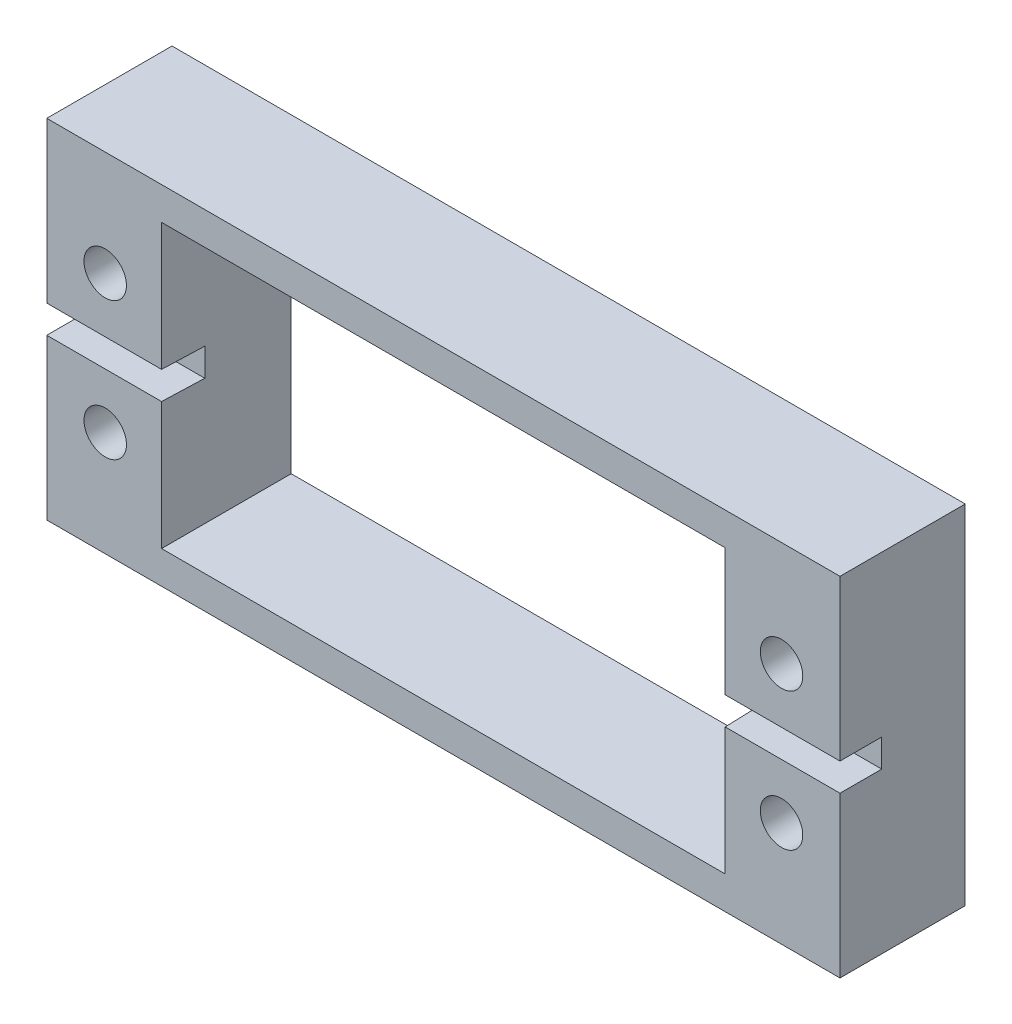
ISO-10303-21;
HEADER;
FILE_DESCRIPTION(('STEP AP214'),'2;1');
FILE_NAME('part.step','',(''),(''),'','','');
FILE_SCHEMA(('AUTOMOTIVE_DESIGN { 1 0 10303 214 1 1 1 1 }'));
ENDSEC;
DATA;
#1=APPLICATION_CONTEXT('core data for automotive mechanical design processes');
#2=APPLICATION_PROTOCOL_DEFINITION('international standard','automotive_design',2000,#1);
#3=PRODUCT_CONTEXT('',#1,'mechanical');
#4=PRODUCT('Part','Part','',(#3));
#5=PRODUCT_RELATED_PRODUCT_CATEGORY('part','',(#4));
#6=PRODUCT_DEFINITION_FORMATION('','',#4);
#7=PRODUCT_DEFINITION_CONTEXT('part definition',#1,'design');
#8=PRODUCT_DEFINITION('design','',#6,#7);
#9=PRODUCT_DEFINITION_SHAPE('','',#8);
#10=(LENGTH_UNIT() NAMED_UNIT(*) SI_UNIT(.MILLI.,.METRE.));
#11=(NAMED_UNIT(*) PLANE_ANGLE_UNIT() SI_UNIT($,.RADIAN.));
#12=(NAMED_UNIT(*) SI_UNIT($,.STERADIAN.) SOLID_ANGLE_UNIT());
#13=UNCERTAINTY_MEASURE_WITH_UNIT(LENGTH_MEASURE(1.E-05),#10,'distance_accuracy_value','');
#14=(GEOMETRIC_REPRESENTATION_CONTEXT(3) GLOBAL_UNCERTAINTY_ASSIGNED_CONTEXT((#13)) GLOBAL_UNIT_ASSIGNED_CONTEXT((#10,
#11,#12)) REPRESENTATION_CONTEXT('',''));
#15=CARTESIAN_POINT('',(0.,0.,0.));
#16=DIRECTION('',(0.,0.,1.));
#17=DIRECTION('',(1.,0.,0.));
#18=AXIS2_PLACEMENT_3D('',#15,#16,#17);
#19=CARTESIAN_POINT('',(-28.5,-1.,6.));
#20=DIRECTION('',(0.,-1.,0.));
#21=DIRECTION('',(0.,0.,-1.));
#22=AXIS2_PLACEMENT_3D('',#19,#20,#21);
#23=PLANE('',#22);
#24=DIRECTION('',(1.,0.,0.));
#25=VECTOR('',#24,1.);
#26=CARTESIAN_POINT('',(-28.5,-1.,6.));
#27=LINE('',#26,#25);
#28=CARTESIAN_POINT('',(20.1452376915248,-1.,6.));
#29=VERTEX_POINT('',#28);
#30=CARTESIAN_POINT('',(28.5,-1.,6.));
#31=VERTEX_POINT('',#30);
#32=EDGE_CURVE('E205',#29,#31,#27,.T.);
#33=ORIENTED_EDGE('',*,*,#32,.F.);
#34=DIRECTION('',(0.034899496702501,0.,0.999390827019096));
#35=VECTOR('',#34,1.);
#36=CARTESIAN_POINT('',(20.085989014467,-1.,4.30333987709721));
#37=LINE('',#36,#35);
#38=CARTESIAN_POINT('',(20.25,-0.999999999999999,9.));
#39=VERTEX_POINT('',#38);
#40=EDGE_CURVE('E189',#29,#39,#37,.T.);
#41=ORIENTED_EDGE('',*,*,#40,.T.);
#42=DIRECTION('',(1.,0.,0.));
#43=VECTOR('',#42,1.);
#44=CARTESIAN_POINT('',(-28.5,-1.,9.));
#45=LINE('',#44,#43);
#46=CARTESIAN_POINT('',(28.5,-1.,9.));
#47=VERTEX_POINT('',#46);
#48=EDGE_CURVE('E212',#39,#47,#45,.T.);
#49=ORIENTED_EDGE('',*,*,#48,.T.);
#50=DIRECTION('',(0.,0.,1.));
#51=VECTOR('',#50,1.);
#52=CARTESIAN_POINT('',(28.5,-1.,6.));
#53=LINE('',#52,#51);
#54=EDGE_CURVE('E215',#31,#47,#53,.T.);
#55=ORIENTED_EDGE('',*,*,#54,.F.);
#56=EDGE_LOOP('',(#33,#41,#49,#55));
#57=FACE_BOUND('',#56,.T.);
#58=ADVANCED_FACE('F35',(#57),#23,.F.);
#59=CARTESIAN_POINT('',(-28.5,1.,6.));
#60=DIRECTION('',(0.,1.,0.));
#61=DIRECTION('',(0.,0.,1.));
#62=AXIS2_PLACEMENT_3D('',#59,#60,#61);
#63=PLANE('',#62);
#64=DIRECTION('',(-1.,0.,0.));
#65=VECTOR('',#64,1.);
#66=CARTESIAN_POINT('',(-28.5,1.,9.));
#67=LINE('',#66,#65);
#68=CARTESIAN_POINT('',(28.5,1.,9.));
#69=VERTEX_POINT('',#68);
#70=CARTESIAN_POINT('',(20.25,0.999999999999999,9.));
#71=VERTEX_POINT('',#70);
#72=EDGE_CURVE('E210',#69,#71,#67,.T.);
#73=ORIENTED_EDGE('',*,*,#72,.T.);
#74=DIRECTION('',(-0.034899496702501,0.,-0.999390827019096));
#75=VECTOR('',#74,1.);
#76=CARTESIAN_POINT('',(20.085989014467,1.,4.30333987709721));
#77=LINE('',#76,#75);
#78=CARTESIAN_POINT('',(20.1452376915248,1.,6.));
#79=VERTEX_POINT('',#78);
#80=EDGE_CURVE('E160',#71,#79,#77,.T.);
#81=ORIENTED_EDGE('',*,*,#80,.T.);
#82=DIRECTION('',(-1.,0.,0.));
#83=VECTOR('',#82,1.);
#84=CARTESIAN_POINT('',(-28.5,1.,6.));
#85=LINE('',#84,#83);
#86=CARTESIAN_POINT('',(28.5,1.,6.));
#87=VERTEX_POINT('',#86);
#88=EDGE_CURVE('E200',#87,#79,#85,.T.);
#89=ORIENTED_EDGE('',*,*,#88,.F.);
#90=DIRECTION('',(0.,0.,1.));
#91=VECTOR('',#90,1.);
#92=CARTESIAN_POINT('',(28.5,1.,6.));
#93=LINE('',#92,#91);
#94=EDGE_CURVE('E209',#87,#69,#93,.T.);
#95=ORIENTED_EDGE('',*,*,#94,.T.);
#96=EDGE_LOOP('',(#73,#81,#89,#95));
#97=FACE_BOUND('',#96,.T.);
#98=ADVANCED_FACE('F298',(#97),#63,.F.);
#99=CARTESIAN_POINT('',(0.,0.,6.));
#100=DIRECTION('',(0.,0.,-1.));
#101=DIRECTION('',(-1.,0.,0.));
#102=AXIS2_PLACEMENT_3D('',#99,#100,#101);
#103=PLANE('',#102);
#104=ORIENTED_EDGE('',*,*,#88,.T.);
#105=DIRECTION('',(0.,-1.,0.));
#106=VECTOR('',#105,1.);
#107=CARTESIAN_POINT('',(20.1452376915248,0.,6.));
#108=LINE('',#107,#106);
#109=EDGE_CURVE('E283',#79,#29,#108,.T.);
#110=ORIENTED_EDGE('',*,*,#109,.T.);
#111=ORIENTED_EDGE('',*,*,#32,.T.);
#112=DIRECTION('',(0.,1.,0.));
#113=VECTOR('',#112,1.);
#114=CARTESIAN_POINT('',(28.5,-1.,6.));
#115=LINE('',#114,#113);
#116=EDGE_CURVE('E195',#31,#87,#115,.T.);
#117=ORIENTED_EDGE('',*,*,#116,.T.);
#118=EDGE_LOOP('',(#104,#110,#111,#117));
#119=FACE_BOUND('',#118,.T.);
#120=ADVANCED_FACE('F287',(#119),#103,.F.);
#121=CARTESIAN_POINT('',(0.,0.,9.));
#122=DIRECTION('',(0.,0.,-1.));
#123=DIRECTION('',(-1.,0.,0.));
#124=AXIS2_PLACEMENT_3D('',#121,#122,#123);
#125=PLANE('',#124);
#126=CARTESIAN_POINT('',(24.3,-4.95,9.));
#127=DIRECTION('',(0.,0.,1.));
#128=DIRECTION('',(-1.,0.,0.));
#129=AXIS2_PLACEMENT_3D('',#126,#127,#128);
#130=CIRCLE('',#129,1.525);
#131=CARTESIAN_POINT('',(22.775,-4.95,9.));
#132=VERTEX_POINT('',#131);
#133=EDGE_CURVE('E225',#132,#132,#130,.T.);
#134=ORIENTED_EDGE('',*,*,#133,.F.);
#135=EDGE_LOOP('',(#134));
#136=FACE_BOUND('',#135,.T.);
#137=CARTESIAN_POINT('',(-24.3,-4.95,9.));
#138=DIRECTION('',(0.,0.,1.));
#139=DIRECTION('',(1.,0.,0.));
#140=AXIS2_PLACEMENT_3D('',#137,#138,#139);
#141=CIRCLE('',#140,1.525);
#142=CARTESIAN_POINT('',(-22.775,-4.95,9.));
#143=VERTEX_POINT('',#142);
#144=EDGE_CURVE('E231',#143,#143,#141,.T.);
#145=ORIENTED_EDGE('',*,*,#144,.F.);
#146=EDGE_LOOP('',(#145));
#147=FACE_BOUND('',#146,.T.);
#148=ORIENTED_EDGE('',*,*,#48,.F.);
#149=DIRECTION('',(0.,1.,0.));
#150=VECTOR('',#149,1.);
#151=CARTESIAN_POINT('',(20.25,-10.15,9.));
#152=LINE('',#151,#150);
#153=CARTESIAN_POINT('',(20.25,-10.15,9.));
#154=VERTEX_POINT('',#153);
#155=EDGE_CURVE('E164',#154,#39,#152,.T.);
#156=ORIENTED_EDGE('',*,*,#155,.F.);
#157=DIRECTION('',(1.,0.,0.));
#158=VECTOR('',#157,1.);
#159=CARTESIAN_POINT('',(-20.25,-10.15,9.));
#160=LINE('',#159,#158);
#161=CARTESIAN_POINT('',(-20.25,-10.15,9.));
#162=VERTEX_POINT('',#161);
#163=EDGE_CURVE('E154',#162,#154,#160,.T.);
#164=ORIENTED_EDGE('',*,*,#163,.F.);
#165=DIRECTION('',(0.,-1.,0.));
#166=VECTOR('',#165,1.);
#167=CARTESIAN_POINT('',(-20.25,-10.15,9.));
#168=LINE('',#167,#166);
#169=CARTESIAN_POINT('',(-20.25,-0.999999999999999,9.));
#170=VERTEX_POINT('',#169);
#171=EDGE_CURVE('E170',#170,#162,#168,.T.);
#172=ORIENTED_EDGE('',*,*,#171,.F.);
#173=CARTESIAN_POINT('',(-28.5,-1.,9.));
#174=VERTEX_POINT('',#173);
#175=EDGE_CURVE('E199',#174,#170,#45,.T.);
#176=ORIENTED_EDGE('',*,*,#175,.F.);
#177=DIRECTION('',(0.,-1.,0.));
#178=VECTOR('',#177,1.);
#179=CARTESIAN_POINT('',(-28.5,-12.5,9.));
#180=LINE('',#179,#178);
#181=CARTESIAN_POINT('',(-28.5,-12.5,9.));
#182=VERTEX_POINT('',#181);
#183=EDGE_CURVE('E255',#174,#182,#180,.T.);
#184=ORIENTED_EDGE('',*,*,#183,.T.);
#185=DIRECTION('',(1.,0.,0.));
#186=VECTOR('',#185,1.);
#187=CARTESIAN_POINT('',(-28.5,-12.5,9.));
#188=LINE('',#187,#186);
#189=CARTESIAN_POINT('',(28.5,-12.5,9.));
#190=VERTEX_POINT('',#189);
#191=EDGE_CURVE('E259',#182,#190,#188,.T.);
#192=ORIENTED_EDGE('',*,*,#191,.T.);
#193=DIRECTION('',(0.,1.,0.));
#194=VECTOR('',#193,1.);
#195=CARTESIAN_POINT('',(28.5,-12.5,9.));
#196=LINE('',#195,#194);
#197=EDGE_CURVE('E249',#190,#47,#196,.T.);
#198=ORIENTED_EDGE('',*,*,#197,.T.);
#199=EDGE_LOOP('',(#148,#156,#164,#172,#176,#184,#192,#198));
#200=FACE_BOUND('',#199,.T.);
#201=ADVANCED_FACE('F330',(#136,#147,#200),#125,.F.);
#202=DIRECTION('',(-1.,0.,0.));
#203=VECTOR('',#202,1.);
#204=CARTESIAN_POINT('',(-20.25,10.15,9.));
#205=LINE('',#204,#203);
#206=CARTESIAN_POINT('',(20.25,10.15,9.));
#207=VERTEX_POINT('',#206);
#208=CARTESIAN_POINT('',(-20.25,10.15,9.));
#209=VERTEX_POINT('',#208);
#210=EDGE_CURVE('E149',#207,#209,#205,.T.);
#211=ORIENTED_EDGE('',*,*,#210,.F.);
#212=EDGE_CURVE('E157',#71,#207,#152,.T.);
#213=ORIENTED_EDGE('',*,*,#212,.F.);
#214=ORIENTED_EDGE('',*,*,#72,.F.);
#215=CARTESIAN_POINT('',(28.5,12.5,9.));
#216=VERTEX_POINT('',#215);
#217=EDGE_CURVE('E253',#69,#216,#196,.T.);
#218=ORIENTED_EDGE('',*,*,#217,.T.);
#219=DIRECTION('',(-1.,0.,0.));
#220=VECTOR('',#219,1.);
#221=CARTESIAN_POINT('',(-28.5,12.5,9.));
#222=LINE('',#221,#220);
#223=CARTESIAN_POINT('',(-28.5,12.5,9.));
#224=VERTEX_POINT('',#223);
#225=EDGE_CURVE('E252',#216,#224,#222,.T.);
#226=ORIENTED_EDGE('',*,*,#225,.T.);
#227=CARTESIAN_POINT('',(-28.5,1.,9.));
#228=VERTEX_POINT('',#227);
#229=EDGE_CURVE('E256',#224,#228,#180,.T.);
#230=ORIENTED_EDGE('',*,*,#229,.T.);
#231=CARTESIAN_POINT('',(-20.25,0.999999999999999,9.));
#232=VERTEX_POINT('',#231);
#233=EDGE_CURVE('E194',#232,#228,#67,.T.);
#234=ORIENTED_EDGE('',*,*,#233,.F.);
#235=EDGE_CURVE('E169',#209,#232,#168,.T.);
#236=ORIENTED_EDGE('',*,*,#235,.F.);
#237=EDGE_LOOP('',(#211,#213,#214,#218,#226,#230,#234,#236));
#238=FACE_BOUND('',#237,.T.);
#239=CARTESIAN_POINT('',(24.3,4.95,9.));
#240=DIRECTION('',(0.,0.,1.));
#241=DIRECTION('',(1.,0.,0.));
#242=AXIS2_PLACEMENT_3D('',#239,#240,#241);
#243=CIRCLE('',#242,1.525);
#244=CARTESIAN_POINT('',(25.825,4.95,9.));
#245=VERTEX_POINT('',#244);
#246=EDGE_CURVE('E243',#245,#245,#243,.T.);
#247=ORIENTED_EDGE('',*,*,#246,.F.);
#248=EDGE_LOOP('',(#247));
#249=FACE_BOUND('',#248,.T.);
#250=CARTESIAN_POINT('',(-24.3,4.95,9.));
#251=DIRECTION('',(0.,0.,1.));
#252=DIRECTION('',(-1.,0.,0.));
#253=AXIS2_PLACEMENT_3D('',#250,#251,#252);
#254=CIRCLE('',#253,1.525);
#255=CARTESIAN_POINT('',(-25.825,4.95,9.));
#256=VERTEX_POINT('',#255);
#257=EDGE_CURVE('E237',#256,#256,#254,.T.);
#258=ORIENTED_EDGE('',*,*,#257,.F.);
#259=EDGE_LOOP('',(#258));
#260=FACE_BOUND('',#259,.T.);
#261=ADVANCED_FACE('F166',(#238,#249,#260),#125,.F.);
#262=CARTESIAN_POINT('',(0.,0.,0.));
#263=DIRECTION('',(0.,0.,-1.));
#264=DIRECTION('',(-1.,0.,0.));
#265=AXIS2_PLACEMENT_3D('',#262,#263,#264);
#266=PLANE('',#265);
#267=DIRECTION('',(0.,-1.,0.));
#268=VECTOR('',#267,1.);
#269=CARTESIAN_POINT('',(19.9357130745743,0.,0.));
#270=LINE('',#269,#268);
#271=CARTESIAN_POINT('',(19.9357130745743,9.83571307457427,0.));
#272=VERTEX_POINT('',#271);
#273=CARTESIAN_POINT('',(19.9357130745743,-9.83571307457427,0.));
#274=VERTEX_POINT('',#273);
#275=EDGE_CURVE('E192',#272,#274,#270,.T.);
#276=ORIENTED_EDGE('',*,*,#275,.F.);
#277=DIRECTION('',(1.,0.,0.));
#278=VECTOR('',#277,1.);
#279=CARTESIAN_POINT('',(0.,9.83571307457427,0.));
#280=LINE('',#279,#278);
#281=CARTESIAN_POINT('',(-19.9357130745743,9.83571307457427,0.));
#282=VERTEX_POINT('',#281);
#283=EDGE_CURVE('E43',#282,#272,#280,.T.);
#284=ORIENTED_EDGE('',*,*,#283,.F.);
#285=DIRECTION('',(0.,1.,0.));
#286=VECTOR('',#285,1.);
#287=CARTESIAN_POINT('',(-19.9357130745743,0.,0.));
#288=LINE('',#287,#286);
#289=CARTESIAN_POINT('',(-19.9357130745743,-9.83571307457427,0.));
#290=VERTEX_POINT('',#289);
#291=EDGE_CURVE('E186',#290,#282,#288,.T.);
#292=ORIENTED_EDGE('',*,*,#291,.F.);
#293=DIRECTION('',(-1.,0.,0.));
#294=VECTOR('',#293,1.);
#295=CARTESIAN_POINT('',(0.,-9.83571307457427,0.));
#296=LINE('',#295,#294);
#297=EDGE_CURVE('E11',#274,#290,#296,.T.);
#298=ORIENTED_EDGE('',*,*,#297,.F.);
#299=EDGE_LOOP('',(#276,#284,#292,#298));
#300=FACE_BOUND('',#299,.T.);
#301=CARTESIAN_POINT('',(-24.3,-4.95,0.));
#302=DIRECTION('',(0.,0.,1.));
#303=DIRECTION('',(1.,0.,0.));
#304=AXIS2_PLACEMENT_3D('',#301,#302,#303);
#305=CIRCLE('',#304,1.525);
#306=CARTESIAN_POINT('',(-22.775,-4.95,0.));
#307=VERTEX_POINT('',#306);
#308=EDGE_CURVE('E228',#307,#307,#305,.T.);
#309=ORIENTED_EDGE('',*,*,#308,.T.);
#310=EDGE_LOOP('',(#309));
#311=FACE_BOUND('',#310,.T.);
#312=CARTESIAN_POINT('',(24.3,4.95,0.));
#313=DIRECTION('',(0.,0.,1.));
#314=DIRECTION('',(1.,0.,0.));
#315=AXIS2_PLACEMENT_3D('',#312,#313,#314);
#316=CIRCLE('',#315,1.525);
#317=CARTESIAN_POINT('',(25.825,4.95,0.));
#318=VERTEX_POINT('',#317);
#319=EDGE_CURVE('E240',#318,#318,#316,.T.);
#320=ORIENTED_EDGE('',*,*,#319,.T.);
#321=EDGE_LOOP('',(#320));
#322=FACE_BOUND('',#321,.T.);
#323=DIRECTION('',(0.,1.,0.));
#324=VECTOR('',#323,1.);
#325=CARTESIAN_POINT('',(28.5,-12.5,0.));
#326=LINE('',#325,#324);
#327=CARTESIAN_POINT('',(28.5,-12.5,0.));
#328=VERTEX_POINT('',#327);
#329=CARTESIAN_POINT('',(28.5,12.5,0.));
#330=VERTEX_POINT('',#329);
#331=EDGE_CURVE('E246',#328,#330,#326,.T.);
#332=ORIENTED_EDGE('',*,*,#331,.F.);
#333=DIRECTION('',(1.,0.,0.));
#334=VECTOR('',#333,1.);
#335=CARTESIAN_POINT('',(-28.5,-12.5,0.));
#336=LINE('',#335,#334);
#337=CARTESIAN_POINT('',(-28.5,-12.5,0.));
#338=VERTEX_POINT('',#337);
#339=EDGE_CURVE('E268',#338,#328,#336,.T.);
#340=ORIENTED_EDGE('',*,*,#339,.F.);
#341=DIRECTION('',(0.,-1.,0.));
#342=VECTOR('',#341,1.);
#343=CARTESIAN_POINT('',(-28.5,-12.5,0.));
#344=LINE('',#343,#342);
#345=CARTESIAN_POINT('',(-28.5,12.5,0.));
#346=VERTEX_POINT('',#345);
#347=EDGE_CURVE('E266',#346,#338,#344,.T.);
#348=ORIENTED_EDGE('',*,*,#347,.F.);
#349=DIRECTION('',(-1.,0.,0.));
#350=VECTOR('',#349,1.);
#351=CARTESIAN_POINT('',(-28.5,12.5,0.));
#352=LINE('',#351,#350);
#353=EDGE_CURVE('E264',#330,#346,#352,.T.);
#354=ORIENTED_EDGE('',*,*,#353,.F.);
#355=EDGE_LOOP('',(#332,#340,#348,#354));
#356=FACE_BOUND('',#355,.T.);
#357=CARTESIAN_POINT('',(-24.3,4.95,0.));
#358=DIRECTION('',(0.,0.,1.));
#359=DIRECTION('',(-1.,0.,0.));
#360=AXIS2_PLACEMENT_3D('',#357,#358,#359);
#361=CIRCLE('',#360,1.525);
#362=CARTESIAN_POINT('',(-25.825,4.95,0.));
#363=VERTEX_POINT('',#362);
#364=EDGE_CURVE('E234',#363,#363,#361,.T.);
#365=ORIENTED_EDGE('',*,*,#364,.T.);
#366=EDGE_LOOP('',(#365));
#367=FACE_BOUND('',#366,.T.);
#368=CARTESIAN_POINT('',(24.3,-4.95,0.));
#369=DIRECTION('',(0.,0.,1.));
#370=DIRECTION('',(-1.,0.,0.));
#371=AXIS2_PLACEMENT_3D('',#368,#369,#370);
#372=CIRCLE('',#371,1.525);
#373=CARTESIAN_POINT('',(22.775,-4.95,0.));
#374=VERTEX_POINT('',#373);
#375=EDGE_CURVE('E218',#374,#374,#372,.T.);
#376=ORIENTED_EDGE('',*,*,#375,.T.);
#377=EDGE_LOOP('',(#376));
#378=FACE_BOUND('',#377,.T.);
#379=ADVANCED_FACE('F308',(#300,#311,#322,#356,#367,#378),#266,.T.);
#380=CARTESIAN_POINT('',(28.5,-12.5,9.));
#381=DIRECTION('',(-1.,0.,0.));
#382=DIRECTION('',(0.,0.,1.));
#383=AXIS2_PLACEMENT_3D('',#380,#381,#382);
#384=PLANE('',#383);
#385=ORIENTED_EDGE('',*,*,#116,.F.);
#386=ORIENTED_EDGE('',*,*,#54,.T.);
#387=ORIENTED_EDGE('',*,*,#197,.F.);
#388=DIRECTION('',(0.,0.,-1.));
#389=VECTOR('',#388,1.);
#390=CARTESIAN_POINT('',(28.5,-12.5,9.));
#391=LINE('',#390,#389);
#392=EDGE_CURVE('E261',#190,#328,#391,.T.);
#393=ORIENTED_EDGE('',*,*,#392,.T.);
#394=ORIENTED_EDGE('',*,*,#331,.T.);
#395=DIRECTION('',(0.,0.,-1.));
#396=VECTOR('',#395,1.);
#397=CARTESIAN_POINT('',(28.5,12.5,9.));
#398=LINE('',#397,#396);
#399=EDGE_CURVE('E278',#216,#330,#398,.T.);
#400=ORIENTED_EDGE('',*,*,#399,.F.);
#401=ORIENTED_EDGE('',*,*,#217,.F.);
#402=ORIENTED_EDGE('',*,*,#94,.F.);
#403=EDGE_LOOP('',(#385,#386,#387,#393,#394,#400,#401,#402));
#404=FACE_BOUND('',#403,.T.);
#405=ADVANCED_FACE('F37',(#404),#384,.F.);
#406=CARTESIAN_POINT('',(-28.5,12.5,9.));
#407=DIRECTION('',(0.,-1.,0.));
#408=DIRECTION('',(0.,0.,-1.));
#409=AXIS2_PLACEMENT_3D('',#406,#407,#408);
#410=PLANE('',#409);
#411=ORIENTED_EDGE('',*,*,#353,.T.);
#412=DIRECTION('',(0.,0.,-1.));
#413=VECTOR('',#412,1.);
#414=CARTESIAN_POINT('',(-28.5,12.5,9.));
#415=LINE('',#414,#413);
#416=EDGE_CURVE('E275',#224,#346,#415,.T.);
#417=ORIENTED_EDGE('',*,*,#416,.F.);
#418=ORIENTED_EDGE('',*,*,#225,.F.);
#419=ORIENTED_EDGE('',*,*,#399,.T.);
#420=EDGE_LOOP('',(#411,#417,#418,#419));
#421=FACE_BOUND('',#420,.T.);
#422=ADVANCED_FACE('F302',(#421),#410,.F.);
#423=CARTESIAN_POINT('',(-28.5,-12.5,9.));
#424=DIRECTION('',(1.,0.,0.));
#425=DIRECTION('',(0.,0.,-1.));
#426=AXIS2_PLACEMENT_3D('',#423,#424,#425);
#427=PLANE('',#426);
#428=ORIENTED_EDGE('',*,*,#183,.F.);
#429=DIRECTION('',(0.,0.,1.));
#430=VECTOR('',#429,1.);
#431=CARTESIAN_POINT('',(-28.5,-1.,6.));
#432=LINE('',#431,#430);
#433=CARTESIAN_POINT('',(-28.5,-1.,6.));
#434=VERTEX_POINT('',#433);
#435=EDGE_CURVE('E219',#434,#174,#432,.T.);
#436=ORIENTED_EDGE('',*,*,#435,.F.);
#437=DIRECTION('',(0.,-1.,0.));
#438=VECTOR('',#437,1.);
#439=CARTESIAN_POINT('',(-28.5,-1.,6.));
#440=LINE('',#439,#438);
#441=CARTESIAN_POINT('',(-28.5,1.,6.));
#442=VERTEX_POINT('',#441);
#443=EDGE_CURVE('E203',#442,#434,#440,.T.);
#444=ORIENTED_EDGE('',*,*,#443,.F.);
#445=DIRECTION('',(0.,0.,1.));
#446=VECTOR('',#445,1.);
#447=CARTESIAN_POINT('',(-28.5,1.,6.));
#448=LINE('',#447,#446);
#449=EDGE_CURVE('E221',#442,#228,#448,.T.);
#450=ORIENTED_EDGE('',*,*,#449,.T.);
#451=ORIENTED_EDGE('',*,*,#229,.F.);
#452=ORIENTED_EDGE('',*,*,#416,.T.);
#453=ORIENTED_EDGE('',*,*,#347,.T.);
#454=DIRECTION('',(0.,0.,-1.));
#455=VECTOR('',#454,1.);
#456=CARTESIAN_POINT('',(-28.5,-12.5,9.));
#457=LINE('',#456,#455);
#458=EDGE_CURVE('E272',#182,#338,#457,.T.);
#459=ORIENTED_EDGE('',*,*,#458,.F.);
#460=EDGE_LOOP('',(#428,#436,#444,#450,#451,#452,#453,#459));
#461=FACE_BOUND('',#460,.T.);
#462=ADVANCED_FACE('F313',(#461),#427,.F.);
#463=CARTESIAN_POINT('',(-28.5,-12.5,9.));
#464=DIRECTION('',(0.,1.,0.));
#465=DIRECTION('',(0.,0.,1.));
#466=AXIS2_PLACEMENT_3D('',#463,#464,#465);
#467=PLANE('',#466);
#468=ORIENTED_EDGE('',*,*,#339,.T.);
#469=ORIENTED_EDGE('',*,*,#392,.F.);
#470=ORIENTED_EDGE('',*,*,#191,.F.);
#471=ORIENTED_EDGE('',*,*,#458,.T.);
#472=EDGE_LOOP('',(#468,#469,#470,#471));
#473=FACE_BOUND('',#472,.T.);
#474=ADVANCED_FACE('F334',(#473),#467,.F.);
#475=CARTESIAN_POINT('',(24.3,4.95,9.));
#476=DIRECTION('',(0.,0.,-1.));
#477=DIRECTION('',(-1.,0.,0.));
#478=AXIS2_PLACEMENT_3D('',#475,#476,#477);
#479=CYLINDRICAL_SURFACE('',#478,1.525);
#480=ORIENTED_EDGE('',*,*,#246,.T.);
#481=EDGE_LOOP('',(#480));
#482=FACE_BOUND('',#481,.T.);
#483=ORIENTED_EDGE('',*,*,#319,.F.);
#484=EDGE_LOOP('',(#483));
#485=FACE_BOUND('',#484,.T.);
#486=ADVANCED_FACE('F350',(#482,#485),#479,.F.);
#487=CARTESIAN_POINT('',(-24.3,4.95,9.));
#488=DIRECTION('',(0.,0.,-1.));
#489=DIRECTION('',(-1.,0.,0.));
#490=AXIS2_PLACEMENT_3D('',#487,#488,#489);
#491=CYLINDRICAL_SURFACE('',#490,1.525);
#492=ORIENTED_EDGE('',*,*,#257,.T.);
#493=EDGE_LOOP('',(#492));
#494=FACE_BOUND('',#493,.T.);
#495=ORIENTED_EDGE('',*,*,#364,.F.);
#496=EDGE_LOOP('',(#495));
#497=FACE_BOUND('',#496,.T.);
#498=ADVANCED_FACE('F352',(#494,#497),#491,.F.);
#499=CARTESIAN_POINT('',(-24.3,-4.95,9.));
#500=DIRECTION('',(0.,0.,-1.));
#501=DIRECTION('',(-1.,0.,0.));
#502=AXIS2_PLACEMENT_3D('',#499,#500,#501);
#503=CYLINDRICAL_SURFACE('',#502,1.525);
#504=ORIENTED_EDGE('',*,*,#144,.T.);
#505=EDGE_LOOP('',(#504));
#506=FACE_BOUND('',#505,.T.);
#507=ORIENTED_EDGE('',*,*,#308,.F.);
#508=EDGE_LOOP('',(#507));
#509=FACE_BOUND('',#508,.T.);
#510=ADVANCED_FACE('F359',(#506,#509),#503,.F.);
#511=CARTESIAN_POINT('',(24.3,-4.95,9.));
#512=DIRECTION('',(0.,0.,-1.));
#513=DIRECTION('',(-1.,0.,0.));
#514=AXIS2_PLACEMENT_3D('',#511,#512,#513);
#515=CYLINDRICAL_SURFACE('',#514,1.525);
#516=ORIENTED_EDGE('',*,*,#133,.T.);
#517=EDGE_LOOP('',(#516));
#518=FACE_BOUND('',#517,.T.);
#519=ORIENTED_EDGE('',*,*,#375,.F.);
#520=EDGE_LOOP('',(#519));
#521=FACE_BOUND('',#520,.T.);
#522=ADVANCED_FACE('F372',(#518,#521),#515,.F.);
#523=ORIENTED_EDGE('',*,*,#175,.T.);
#524=DIRECTION('',(0.034899496702501,0.,-0.999390827019096));
#525=VECTOR('',#524,1.);
#526=CARTESIAN_POINT('',(-20.155413582062,-1.,6.29139937880478));
#527=LINE('',#526,#525);
#528=CARTESIAN_POINT('',(-20.1452376915248,-1.,6.));
#529=VERTEX_POINT('',#528);
#530=EDGE_CURVE('E183',#170,#529,#527,.T.);
#531=ORIENTED_EDGE('',*,*,#530,.T.);
#532=EDGE_CURVE('E206',#434,#529,#27,.T.);
#533=ORIENTED_EDGE('',*,*,#532,.F.);
#534=ORIENTED_EDGE('',*,*,#435,.T.);
#535=EDGE_LOOP('',(#523,#531,#533,#534));
#536=FACE_BOUND('',#535,.T.);
#537=ADVANCED_FACE('F326',(#536),#23,.F.);
#538=CARTESIAN_POINT('',(-20.1452376915248,1.,6.));
#539=VERTEX_POINT('',#538);
#540=EDGE_CURVE('E198',#539,#442,#85,.T.);
#541=ORIENTED_EDGE('',*,*,#540,.F.);
#542=DIRECTION('',(-0.034899496702501,0.,0.999390827019096));
#543=VECTOR('',#542,1.);
#544=CARTESIAN_POINT('',(-20.155413582062,1.,6.29139937880478));
#545=LINE('',#544,#543);
#546=EDGE_CURVE('E58',#539,#232,#545,.T.);
#547=ORIENTED_EDGE('',*,*,#546,.T.);
#548=ORIENTED_EDGE('',*,*,#233,.T.);
#549=ORIENTED_EDGE('',*,*,#449,.F.);
#550=EDGE_LOOP('',(#541,#547,#548,#549));
#551=FACE_BOUND('',#550,.T.);
#552=ADVANCED_FACE('F319',(#551),#63,.F.);
#553=ORIENTED_EDGE('',*,*,#532,.T.);
#554=DIRECTION('',(0.,1.,0.));
#555=VECTOR('',#554,1.);
#556=CARTESIAN_POINT('',(-20.1452376915248,0.,6.));
#557=LINE('',#556,#555);
#558=EDGE_CURVE('E281',#529,#539,#557,.T.);
#559=ORIENTED_EDGE('',*,*,#558,.T.);
#560=ORIENTED_EDGE('',*,*,#540,.T.);
#561=ORIENTED_EDGE('',*,*,#443,.T.);
#562=EDGE_LOOP('',(#553,#559,#560,#561));
#563=FACE_BOUND('',#562,.T.);
#564=ADVANCED_FACE('F321',(#563),#103,.F.);
#565=CARTESIAN_POINT('',(20.25,-10.15,9.));
#566=DIRECTION('',(0.999390827019096,0.,-0.034899496702501));
#567=DIRECTION('',(-0.034899496702501,0.,-0.999390827019096));
#568=AXIS2_PLACEMENT_3D('',#565,#566,#567);
#569=PLANE('',#568);
#570=ORIENTED_EDGE('',*,*,#275,.T.);
#571=DIRECTION('',(0.0348782627423747,-0.0348782627423747,0.998782765958718));
#572=VECTOR('',#571,1.);
#573=CARTESIAN_POINT('',(20.200732024917,-10.100732024917,7.58914978678661));
#574=LINE('',#573,#572);
#575=EDGE_CURVE('E177',#274,#154,#574,.T.);
#576=ORIENTED_EDGE('',*,*,#575,.T.);
#577=ORIENTED_EDGE('',*,*,#155,.T.);
#578=ORIENTED_EDGE('',*,*,#40,.F.);
#579=ORIENTED_EDGE('',*,*,#109,.F.);
#580=ORIENTED_EDGE('',*,*,#80,.F.);
#581=ORIENTED_EDGE('',*,*,#212,.T.);
#582=DIRECTION('',(0.0348782627423747,0.0348782627423747,0.998782765958718));
#583=VECTOR('',#582,1.);
#584=CARTESIAN_POINT('',(20.2253051877979,10.1253051877979,8.29283310300662));
#585=LINE('',#584,#583);
#586=EDGE_CURVE('E145',#272,#207,#585,.T.);
#587=ORIENTED_EDGE('',*,*,#586,.F.);
#588=EDGE_LOOP('',(#570,#576,#577,#578,#579,#580,#581,#587));
#589=FACE_BOUND('',#588,.T.);
#590=ADVANCED_FACE('F158',(#589),#569,.F.);
#591=CARTESIAN_POINT('',(-20.25,-10.15,9.));
#592=DIRECTION('',(-0.999390827019096,0.,-0.034899496702501));
#593=DIRECTION('',(-0.034899496702501,0.,0.999390827019096));
#594=AXIS2_PLACEMENT_3D('',#591,#592,#593);
#595=PLANE('',#594);
#596=ORIENTED_EDGE('',*,*,#291,.T.);
#597=DIRECTION('',(-0.0348782627423747,0.0348782627423747,0.998782765958718));
#598=VECTOR('',#597,1.);
#599=CARTESIAN_POINT('',(-20.25,10.15,9.));
#600=LINE('',#599,#598);
#601=EDGE_CURVE('E50',#282,#209,#600,.T.);
#602=ORIENTED_EDGE('',*,*,#601,.T.);
#603=ORIENTED_EDGE('',*,*,#235,.T.);
#604=ORIENTED_EDGE('',*,*,#546,.F.);
#605=ORIENTED_EDGE('',*,*,#558,.F.);
#606=ORIENTED_EDGE('',*,*,#530,.F.);
#607=ORIENTED_EDGE('',*,*,#171,.T.);
#608=DIRECTION('',(-0.0348782627423747,-0.0348782627423747,0.998782765958718));
#609=VECTOR('',#608,1.);
#610=CARTESIAN_POINT('',(-20.25,-10.15,9.));
#611=LINE('',#610,#609);
#612=EDGE_CURVE('E178',#290,#162,#611,.T.);
#613=ORIENTED_EDGE('',*,*,#612,.F.);
#614=EDGE_LOOP('',(#596,#602,#603,#604,#605,#606,#607,#613));
#615=FACE_BOUND('',#614,.T.);
#616=ADVANCED_FACE('F323',(#615),#595,.F.);
#617=CARTESIAN_POINT('',(-20.25,-10.15,9.));
#618=DIRECTION('',(0.,-0.999390827019096,-0.034899496702501));
#619=DIRECTION('',(0.,0.034899496702501,-0.999390827019096));
#620=AXIS2_PLACEMENT_3D('',#617,#618,#619);
#621=PLANE('',#620);
#622=ORIENTED_EDGE('',*,*,#297,.T.);
#623=ORIENTED_EDGE('',*,*,#612,.T.);
#624=ORIENTED_EDGE('',*,*,#163,.T.);
#625=ORIENTED_EDGE('',*,*,#575,.F.);
#626=EDGE_LOOP('',(#622,#623,#624,#625));
#627=FACE_BOUND('',#626,.T.);
#628=ADVANCED_FACE('F339',(#627),#621,.F.);
#629=CARTESIAN_POINT('',(-20.25,10.15,9.));
#630=DIRECTION('',(0.,0.999390827019096,-0.034899496702501));
#631=DIRECTION('',(0.,0.034899496702501,0.999390827019096));
#632=AXIS2_PLACEMENT_3D('',#629,#630,#631);
#633=PLANE('',#632);
#634=ORIENTED_EDGE('',*,*,#283,.T.);
#635=ORIENTED_EDGE('',*,*,#586,.T.);
#636=ORIENTED_EDGE('',*,*,#210,.T.);
#637=ORIENTED_EDGE('',*,*,#601,.F.);
#638=EDGE_LOOP('',(#634,#635,#636,#637));
#639=FACE_BOUND('',#638,.T.);
#640=ADVANCED_FACE('F147',(#639),#633,.F.);
#641=CLOSED_SHELL('',(#58,#98,#120,#201,#261,#379,#405,#422,#462,#474,#486,#498,#510,#522,#537,
#552,#564,#590,#616,#628,#640));
#642=MANIFOLD_SOLID_BREP('B2',#641);
#643=ADVANCED_BREP_SHAPE_REPRESENTATION('',(#18,#642),#14);
#644=SHAPE_DEFINITION_REPRESENTATION(#9,#643);
ENDSEC;
END-ISO-10303-21;
